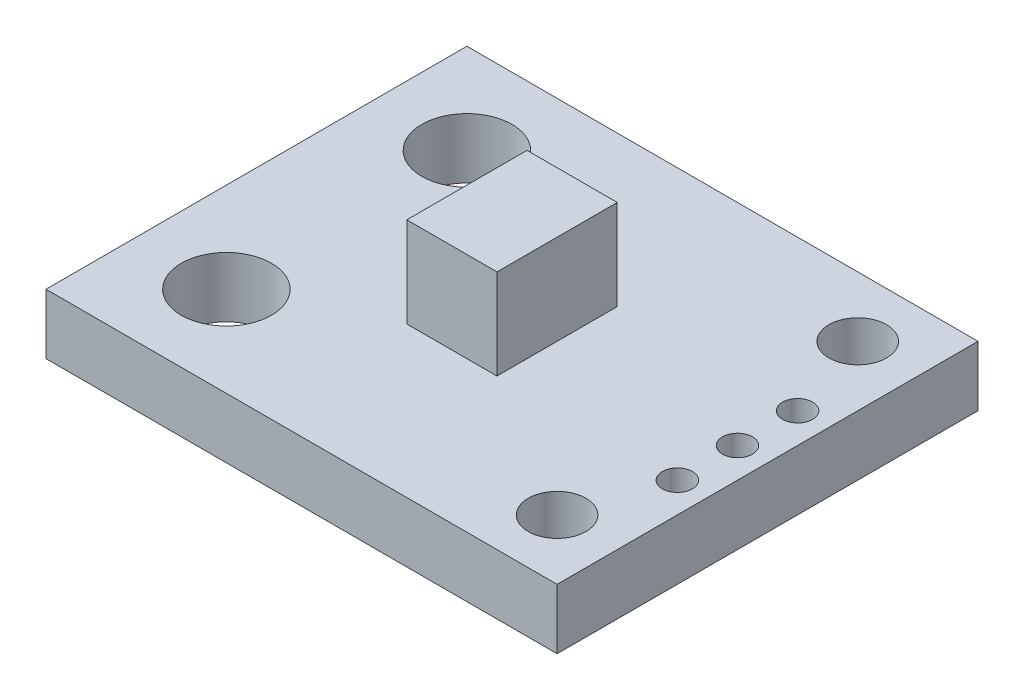
ISO-10303-21;
HEADER;
FILE_DESCRIPTION(('STEP AP214'),'2;1');
FILE_NAME('part.step','',(''),(''),'','','');
FILE_SCHEMA(('AUTOMOTIVE_DESIGN { 1 0 10303 214 1 1 1 1 }'));
ENDSEC;
DATA;
#1=APPLICATION_CONTEXT('core data for automotive mechanical design processes');
#2=APPLICATION_PROTOCOL_DEFINITION('international standard','automotive_design',2000,#1);
#3=PRODUCT_CONTEXT('',#1,'mechanical');
#4=PRODUCT('Part','Part','',(#3));
#5=PRODUCT_RELATED_PRODUCT_CATEGORY('part','',(#4));
#6=PRODUCT_DEFINITION_FORMATION('','',#4);
#7=PRODUCT_DEFINITION_CONTEXT('part definition',#1,'design');
#8=PRODUCT_DEFINITION('design','',#6,#7);
#9=PRODUCT_DEFINITION_SHAPE('','',#8);
#10=(LENGTH_UNIT() NAMED_UNIT(*) SI_UNIT(.MILLI.,.METRE.));
#11=(NAMED_UNIT(*) PLANE_ANGLE_UNIT() SI_UNIT($,.RADIAN.));
#12=(NAMED_UNIT(*) SI_UNIT($,.STERADIAN.) SOLID_ANGLE_UNIT());
#13=UNCERTAINTY_MEASURE_WITH_UNIT(LENGTH_MEASURE(1.E-05),#10,'distance_accuracy_value','');
#14=(GEOMETRIC_REPRESENTATION_CONTEXT(3) GLOBAL_UNCERTAINTY_ASSIGNED_CONTEXT((#13)) GLOBAL_UNIT_ASSIGNED_CONTEXT((#10,
#11,#12)) REPRESENTATION_CONTEXT('',''));
#15=CARTESIAN_POINT('',(0.,0.,0.));
#16=DIRECTION('',(0.,0.,1.));
#17=DIRECTION('',(1.,0.,0.));
#18=AXIS2_PLACEMENT_3D('',#15,#16,#17);
#19=CARTESIAN_POINT('',(0.,2.53999999999999,0.));
#20=DIRECTION('',(0.,1.,0.));
#21=DIRECTION('',(0.,0.,1.));
#22=AXIS2_PLACEMENT_3D('',#19,#20,#21);
#23=PLANE('',#22);
#24=CARTESIAN_POINT('',(8.255,2.53999999999999,-6.34999999999991));
#25=DIRECTION('',(0.,1.,0.));
#26=DIRECTION('',(0.,0.,1.));
#27=AXIS2_PLACEMENT_3D('',#24,#25,#26);
#28=CIRCLE('',#27,1.2192);
#29=CARTESIAN_POINT('',(8.255,2.53999999999999,-5.13079999999991));
#30=VERTEX_POINT('',#29);
#31=EDGE_CURVE('E264',#30,#30,#28,.T.);
#32=ORIENTED_EDGE('',*,*,#31,.F.);
#33=EDGE_LOOP('',(#32));
#34=FACE_BOUND('',#33,.T.);
#35=CARTESIAN_POINT('',(8.255,2.53999999999999,6.35000000000002));
#36=DIRECTION('',(0.,1.,0.));
#37=DIRECTION('',(0.,0.,1.));
#38=AXIS2_PLACEMENT_3D('',#35,#36,#37);
#39=CIRCLE('',#38,1.2192);
#40=CARTESIAN_POINT('',(8.255,2.53999999999999,7.56920000000002));
#41=VERTEX_POINT('',#40);
#42=EDGE_CURVE('E267',#41,#41,#39,.T.);
#43=ORIENTED_EDGE('',*,*,#42,.F.);
#44=EDGE_LOOP('',(#43));
#45=FACE_BOUND('',#44,.T.);
#46=DIRECTION('',(0.,0.,-1.));
#47=VECTOR('',#46,1.);
#48=CARTESIAN_POINT('',(10.795,2.53999999999999,-8.8899999999999));
#49=LINE('',#48,#47);
#50=CARTESIAN_POINT('',(10.795,2.53999999999999,8.89000000000001));
#51=VERTEX_POINT('',#50);
#52=CARTESIAN_POINT('',(10.795,2.53999999999999,-8.8899999999999));
#53=VERTEX_POINT('',#52);
#54=EDGE_CURVE('E171',#51,#53,#49,.T.);
#55=ORIENTED_EDGE('',*,*,#54,.T.);
#56=DIRECTION('',(-1.,0.,0.));
#57=VECTOR('',#56,1.);
#58=CARTESIAN_POINT('',(-10.795,2.53999999999999,-8.8899999999999));
#59=LINE('',#58,#57);
#60=CARTESIAN_POINT('',(-10.795,2.53999999999999,-8.8899999999999));
#61=VERTEX_POINT('',#60);
#62=EDGE_CURVE('E89',#53,#61,#59,.T.);
#63=ORIENTED_EDGE('',*,*,#62,.T.);
#64=DIRECTION('',(0.,0.,1.));
#65=VECTOR('',#64,1.);
#66=CARTESIAN_POINT('',(-10.795,2.53999999999999,-8.8899999999999));
#67=LINE('',#66,#65);
#68=CARTESIAN_POINT('',(-10.795,2.53999999999999,8.89000000000012));
#69=VERTEX_POINT('',#68);
#70=EDGE_CURVE('E174',#61,#69,#67,.T.);
#71=ORIENTED_EDGE('',*,*,#70,.T.);
#72=DIRECTION('',(1.,0.,0.));
#73=VECTOR('',#72,1.);
#74=CARTESIAN_POINT('',(-10.795,2.53999999999999,8.89000000000012));
#75=LINE('',#74,#73);
#76=EDGE_CURVE('E61',#69,#51,#75,.T.);
#77=ORIENTED_EDGE('',*,*,#76,.T.);
#78=EDGE_LOOP('',(#55,#63,#71,#77));
#79=FACE_BOUND('',#78,.T.);
#80=CARTESIAN_POINT('',(-6.985,2.53999999999999,-5.07999999999997));
#81=DIRECTION('',(0.,1.,0.));
#82=DIRECTION('',(0.,0.,1.));
#83=AXIS2_PLACEMENT_3D('',#80,#81,#82);
#84=CIRCLE('',#83,1.905);
#85=CARTESIAN_POINT('',(-6.985,2.53999999999999,-3.17499999999997));
#86=VERTEX_POINT('',#85);
#87=EDGE_CURVE('E162',#86,#86,#84,.T.);
#88=ORIENTED_EDGE('',*,*,#87,.F.);
#89=EDGE_LOOP('',(#88));
#90=FACE_BOUND('',#89,.T.);
#91=CARTESIAN_POINT('',(-6.985,2.53999999999999,5.07999999999997));
#92=DIRECTION('',(0.,1.,0.));
#93=DIRECTION('',(0.,0.,1.));
#94=AXIS2_PLACEMENT_3D('',#91,#92,#93);
#95=CIRCLE('',#94,1.905);
#96=CARTESIAN_POINT('',(-6.985,2.53999999999999,6.98499999999997));
#97=VERTEX_POINT('',#96);
#98=EDGE_CURVE('E156',#97,#97,#95,.T.);
#99=ORIENTED_EDGE('',*,*,#98,.F.);
#100=EDGE_LOOP('',(#99));
#101=FACE_BOUND('',#100,.T.);
#102=CARTESIAN_POINT('',(9.52500000000001,2.53999999999999,-2.53999999999999));
#103=DIRECTION('',(0.,1.,0.));
#104=DIRECTION('',(0.,0.,1.));
#105=AXIS2_PLACEMENT_3D('',#102,#103,#104);
#106=CIRCLE('',#105,0.635000000000001);
#107=CARTESIAN_POINT('',(9.52500000000001,2.53999999999999,-1.90499999999999));
#108=VERTEX_POINT('',#107);
#109=EDGE_CURVE('E150',#108,#108,#106,.T.);
#110=ORIENTED_EDGE('',*,*,#109,.F.);
#111=EDGE_LOOP('',(#110));
#112=FACE_BOUND('',#111,.T.);
#113=CARTESIAN_POINT('',(9.525,2.53999999999999,0.));
#114=DIRECTION('',(0.,1.,0.));
#115=DIRECTION('',(0.,0.,1.));
#116=AXIS2_PLACEMENT_3D('',#113,#114,#115);
#117=CIRCLE('',#116,0.635000000000004);
#118=CARTESIAN_POINT('',(9.525,2.53999999999999,0.635000000000004));
#119=VERTEX_POINT('',#118);
#120=EDGE_CURVE('E145',#119,#119,#117,.T.);
#121=ORIENTED_EDGE('',*,*,#120,.F.);
#122=EDGE_LOOP('',(#121));
#123=FACE_BOUND('',#122,.T.);
#124=CARTESIAN_POINT('',(9.525,2.53999999999999,2.53999999999999));
#125=DIRECTION('',(0.,1.,0.));
#126=DIRECTION('',(0.,0.,1.));
#127=AXIS2_PLACEMENT_3D('',#124,#125,#126);
#128=CIRCLE('',#127,0.635000000000001);
#129=CARTESIAN_POINT('',(9.525,2.53999999999999,3.17499999999999));
#130=VERTEX_POINT('',#129);
#131=EDGE_CURVE('E136',#130,#130,#128,.T.);
#132=ORIENTED_EDGE('',*,*,#131,.F.);
#133=EDGE_LOOP('',(#132));
#134=FACE_BOUND('',#133,.T.);
#135=DIRECTION('',(-1.,0.,0.));
#136=VECTOR('',#135,1.);
#137=CARTESIAN_POINT('',(-1.90499999999999,2.53999999999999,-2.53999999999999));
#138=LINE('',#137,#136);
#139=CARTESIAN_POINT('',(1.90500000000001,2.53999999999999,-2.53999999999999));
#140=VERTEX_POINT('',#139);
#141=CARTESIAN_POINT('',(-1.90499999999999,2.53999999999999,-2.53999999999999));
#142=VERTEX_POINT('',#141);
#143=EDGE_CURVE('E279',#140,#142,#138,.T.);
#144=ORIENTED_EDGE('',*,*,#143,.F.);
#145=DIRECTION('',(0.,0.,-1.));
#146=VECTOR('',#145,1.);
#147=CARTESIAN_POINT('',(1.90500000000001,2.53999999999999,-2.53999999999999));
#148=LINE('',#147,#146);
#149=CARTESIAN_POINT('',(1.90499999999998,2.53999999999999,2.53999999999999));
#150=VERTEX_POINT('',#149);
#151=EDGE_CURVE('E134',#150,#140,#148,.T.);
#152=ORIENTED_EDGE('',*,*,#151,.F.);
#153=DIRECTION('',(1.,0.,0.));
#154=VECTOR('',#153,1.);
#155=CARTESIAN_POINT('',(-1.90500000000001,2.53999999999999,2.53999999999999));
#156=LINE('',#155,#154);
#157=CARTESIAN_POINT('',(-1.90500000000001,2.53999999999999,2.53999999999999));
#158=VERTEX_POINT('',#157);
#159=EDGE_CURVE('E130',#158,#150,#156,.T.);
#160=ORIENTED_EDGE('',*,*,#159,.F.);
#161=DIRECTION('',(0.,0.,1.));
#162=VECTOR('',#161,1.);
#163=CARTESIAN_POINT('',(-1.90499999999999,2.53999999999999,-2.53999999999999));
#164=LINE('',#163,#162);
#165=EDGE_CURVE('E281',#142,#158,#164,.T.);
#166=ORIENTED_EDGE('',*,*,#165,.F.);
#167=EDGE_LOOP('',(#144,#152,#160,#166));
#168=FACE_BOUND('',#167,.T.);
#169=ADVANCED_FACE('F36',(#34,#45,#79,#90,#101,#112,#123,#134,#168),#23,.T.);
#170=CARTESIAN_POINT('',(10.795,2.53999999999999,-8.8899999999999));
#171=DIRECTION('',(-1.,0.,0.));
#172=DIRECTION('',(0.,0.,1.));
#173=AXIS2_PLACEMENT_3D('',#170,#171,#172);
#174=PLANE('',#173);
#175=DIRECTION('',(0.,0.,-1.));
#176=VECTOR('',#175,1.);
#177=CARTESIAN_POINT('',(10.795,0.,-8.8899999999999));
#178=LINE('',#177,#176);
#179=CARTESIAN_POINT('',(10.795,0.,8.89000000000001));
#180=VERTEX_POINT('',#179);
#181=CARTESIAN_POINT('',(10.795,0.,-8.8899999999999));
#182=VERTEX_POINT('',#181);
#183=EDGE_CURVE('E168',#180,#182,#178,.T.);
#184=ORIENTED_EDGE('',*,*,#183,.T.);
#185=DIRECTION('',(0.,-1.,0.));
#186=VECTOR('',#185,1.);
#187=CARTESIAN_POINT('',(10.795,2.53999999999999,-8.8899999999999));
#188=LINE('',#187,#186);
#189=EDGE_CURVE('E11',#53,#182,#188,.T.);
#190=ORIENTED_EDGE('',*,*,#189,.F.);
#191=ORIENTED_EDGE('',*,*,#54,.F.);
#192=DIRECTION('',(0.,-1.,0.));
#193=VECTOR('',#192,1.);
#194=CARTESIAN_POINT('',(10.795,2.53999999999999,8.89000000000001));
#195=LINE('',#194,#193);
#196=EDGE_CURVE('E177',#51,#180,#195,.T.);
#197=ORIENTED_EDGE('',*,*,#196,.T.);
#198=EDGE_LOOP('',(#184,#190,#191,#197));
#199=FACE_BOUND('',#198,.T.);
#200=ADVANCED_FACE('F38',(#199),#174,.F.);
#201=CARTESIAN_POINT('',(-10.795,2.53999999999999,-8.8899999999999));
#202=DIRECTION('',(0.,0.,1.));
#203=DIRECTION('',(1.,0.,0.));
#204=AXIS2_PLACEMENT_3D('',#201,#202,#203);
#205=PLANE('',#204);
#206=DIRECTION('',(-1.,0.,0.));
#207=VECTOR('',#206,1.);
#208=CARTESIAN_POINT('',(-10.795,0.,-8.8899999999999));
#209=LINE('',#208,#207);
#210=CARTESIAN_POINT('',(-10.795,0.,-8.8899999999999));
#211=VERTEX_POINT('',#210);
#212=EDGE_CURVE('E180',#182,#211,#209,.T.);
#213=ORIENTED_EDGE('',*,*,#212,.T.);
#214=DIRECTION('',(0.,-1.,0.));
#215=VECTOR('',#214,1.);
#216=CARTESIAN_POINT('',(-10.795,2.53999999999999,-8.8899999999999));
#217=LINE('',#216,#215);
#218=EDGE_CURVE('E45',#61,#211,#217,.T.);
#219=ORIENTED_EDGE('',*,*,#218,.F.);
#220=ORIENTED_EDGE('',*,*,#62,.F.);
#221=ORIENTED_EDGE('',*,*,#189,.T.);
#222=EDGE_LOOP('',(#213,#219,#220,#221));
#223=FACE_BOUND('',#222,.T.);
#224=ADVANCED_FACE('F210',(#223),#205,.F.);
#225=CARTESIAN_POINT('',(-10.795,2.53999999999999,-8.8899999999999));
#226=DIRECTION('',(1.,0.,0.));
#227=DIRECTION('',(0.,0.,-1.));
#228=AXIS2_PLACEMENT_3D('',#225,#226,#227);
#229=PLANE('',#228);
#230=DIRECTION('',(0.,0.,1.));
#231=VECTOR('',#230,1.);
#232=CARTESIAN_POINT('',(-10.795,0.,-8.8899999999999));
#233=LINE('',#232,#231);
#234=CARTESIAN_POINT('',(-10.795,0.,8.89000000000012));
#235=VERTEX_POINT('',#234);
#236=EDGE_CURVE('E182',#211,#235,#233,.T.);
#237=ORIENTED_EDGE('',*,*,#236,.T.);
#238=DIRECTION('',(0.,-1.,0.));
#239=VECTOR('',#238,1.);
#240=CARTESIAN_POINT('',(-10.795,2.53999999999999,8.89000000000012));
#241=LINE('',#240,#239);
#242=EDGE_CURVE('E186',#69,#235,#241,.T.);
#243=ORIENTED_EDGE('',*,*,#242,.F.);
#244=ORIENTED_EDGE('',*,*,#70,.F.);
#245=ORIENTED_EDGE('',*,*,#218,.T.);
#246=EDGE_LOOP('',(#237,#243,#244,#245));
#247=FACE_BOUND('',#246,.T.);
#248=ADVANCED_FACE('F192',(#247),#229,.F.);
#249=CARTESIAN_POINT('',(-10.795,2.53999999999999,8.89000000000012));
#250=DIRECTION('',(0.,0.,-1.));
#251=DIRECTION('',(-1.,0.,0.));
#252=AXIS2_PLACEMENT_3D('',#249,#250,#251);
#253=PLANE('',#252);
#254=DIRECTION('',(1.,0.,0.));
#255=VECTOR('',#254,1.);
#256=CARTESIAN_POINT('',(-10.795,0.,8.89000000000012));
#257=LINE('',#256,#255);
#258=EDGE_CURVE('E82',#235,#180,#257,.T.);
#259=ORIENTED_EDGE('',*,*,#258,.T.);
#260=ORIENTED_EDGE('',*,*,#196,.F.);
#261=ORIENTED_EDGE('',*,*,#76,.F.);
#262=ORIENTED_EDGE('',*,*,#242,.T.);
#263=EDGE_LOOP('',(#259,#260,#261,#262));
#264=FACE_BOUND('',#263,.T.);
#265=ADVANCED_FACE('F200',(#264),#253,.F.);
#266=CARTESIAN_POINT('',(0.,0.,0.));
#267=DIRECTION('',(0.,1.,0.));
#268=DIRECTION('',(0.,0.,1.));
#269=AXIS2_PLACEMENT_3D('',#266,#267,#268);
#270=PLANE('',#269);
#271=CARTESIAN_POINT('',(8.255,0.,-6.34999999999991));
#272=DIRECTION('',(0.,1.,0.));
#273=DIRECTION('',(0.,0.,1.));
#274=AXIS2_PLACEMENT_3D('',#271,#272,#273);
#275=CIRCLE('',#274,1.2192);
#276=CARTESIAN_POINT('',(8.255,0.,-5.13079999999991));
#277=VERTEX_POINT('',#276);
#278=EDGE_CURVE('E40',#277,#277,#275,.T.);
#279=ORIENTED_EDGE('',*,*,#278,.T.);
#280=EDGE_LOOP('',(#279));
#281=FACE_BOUND('',#280,.T.);
#282=CARTESIAN_POINT('',(8.255,0.,6.35000000000002));
#283=DIRECTION('',(0.,1.,0.));
#284=DIRECTION('',(0.,0.,1.));
#285=AXIS2_PLACEMENT_3D('',#282,#283,#284);
#286=CIRCLE('',#285,1.2192);
#287=CARTESIAN_POINT('',(8.255,0.,7.56920000000002));
#288=VERTEX_POINT('',#287);
#289=EDGE_CURVE('E269',#288,#288,#286,.T.);
#290=ORIENTED_EDGE('',*,*,#289,.T.);
#291=EDGE_LOOP('',(#290));
#292=FACE_BOUND('',#291,.T.);
#293=CARTESIAN_POINT('',(9.525,0.,2.53999999999999));
#294=DIRECTION('',(0.,1.,0.));
#295=DIRECTION('',(0.,0.,1.));
#296=AXIS2_PLACEMENT_3D('',#293,#294,#295);
#297=CIRCLE('',#296,0.635000000000001);
#298=CARTESIAN_POINT('',(9.525,0.,3.17499999999999));
#299=VERTEX_POINT('',#298);
#300=EDGE_CURVE('E139',#299,#299,#297,.T.);
#301=ORIENTED_EDGE('',*,*,#300,.T.);
#302=EDGE_LOOP('',(#301));
#303=FACE_BOUND('',#302,.T.);
#304=CARTESIAN_POINT('',(9.525,0.,0.));
#305=DIRECTION('',(0.,1.,0.));
#306=DIRECTION('',(0.,0.,1.));
#307=AXIS2_PLACEMENT_3D('',#304,#305,#306);
#308=CIRCLE('',#307,0.635000000000004);
#309=CARTESIAN_POINT('',(9.525,0.,0.635000000000004));
#310=VERTEX_POINT('',#309);
#311=EDGE_CURVE('E147',#310,#310,#308,.T.);
#312=ORIENTED_EDGE('',*,*,#311,.T.);
#313=EDGE_LOOP('',(#312));
#314=FACE_BOUND('',#313,.T.);
#315=CARTESIAN_POINT('',(9.52500000000001,0.,-2.53999999999999));
#316=DIRECTION('',(0.,1.,0.));
#317=DIRECTION('',(0.,0.,1.));
#318=AXIS2_PLACEMENT_3D('',#315,#316,#317);
#319=CIRCLE('',#318,0.635000000000001);
#320=CARTESIAN_POINT('',(9.52500000000001,0.,-1.90499999999999));
#321=VERTEX_POINT('',#320);
#322=EDGE_CURVE('E153',#321,#321,#319,.T.);
#323=ORIENTED_EDGE('',*,*,#322,.T.);
#324=EDGE_LOOP('',(#323));
#325=FACE_BOUND('',#324,.T.);
#326=CARTESIAN_POINT('',(-6.985,0.,5.07999999999997));
#327=DIRECTION('',(0.,1.,0.));
#328=DIRECTION('',(0.,0.,1.));
#329=AXIS2_PLACEMENT_3D('',#326,#327,#328);
#330=CIRCLE('',#329,1.905);
#331=CARTESIAN_POINT('',(-6.985,0.,6.98499999999997));
#332=VERTEX_POINT('',#331);
#333=EDGE_CURVE('E159',#332,#332,#330,.T.);
#334=ORIENTED_EDGE('',*,*,#333,.T.);
#335=EDGE_LOOP('',(#334));
#336=FACE_BOUND('',#335,.T.);
#337=CARTESIAN_POINT('',(-6.985,0.,-5.07999999999997));
#338=DIRECTION('',(0.,1.,0.));
#339=DIRECTION('',(0.,0.,1.));
#340=AXIS2_PLACEMENT_3D('',#337,#338,#339);
#341=CIRCLE('',#340,1.905);
#342=CARTESIAN_POINT('',(-6.985,0.,-3.17499999999997));
#343=VERTEX_POINT('',#342);
#344=EDGE_CURVE('E165',#343,#343,#341,.T.);
#345=ORIENTED_EDGE('',*,*,#344,.T.);
#346=EDGE_LOOP('',(#345));
#347=FACE_BOUND('',#346,.T.);
#348=ORIENTED_EDGE('',*,*,#183,.F.);
#349=ORIENTED_EDGE('',*,*,#258,.F.);
#350=ORIENTED_EDGE('',*,*,#236,.F.);
#351=ORIENTED_EDGE('',*,*,#212,.F.);
#352=EDGE_LOOP('',(#348,#349,#350,#351));
#353=FACE_BOUND('',#352,.T.);
#354=ADVANCED_FACE('F196',(#281,#292,#303,#314,#325,#336,#347,#353),#270,.F.);
#355=CARTESIAN_POINT('',(-6.985,0.,-5.07999999999997));
#356=DIRECTION('',(0.,1.,0.));
#357=DIRECTION('',(0.,0.,1.));
#358=AXIS2_PLACEMENT_3D('',#355,#356,#357);
#359=CYLINDRICAL_SURFACE('',#358,1.905);
#360=ORIENTED_EDGE('',*,*,#344,.F.);
#361=EDGE_LOOP('',(#360));
#362=FACE_BOUND('',#361,.T.);
#363=ORIENTED_EDGE('',*,*,#87,.T.);
#364=EDGE_LOOP('',(#363));
#365=FACE_BOUND('',#364,.T.);
#366=ADVANCED_FACE('F207',(#362,#365),#359,.F.);
#367=CARTESIAN_POINT('',(-6.985,0.,5.07999999999997));
#368=DIRECTION('',(0.,1.,0.));
#369=DIRECTION('',(0.,0.,1.));
#370=AXIS2_PLACEMENT_3D('',#367,#368,#369);
#371=CYLINDRICAL_SURFACE('',#370,1.905);
#372=ORIENTED_EDGE('',*,*,#333,.F.);
#373=EDGE_LOOP('',(#372));
#374=FACE_BOUND('',#373,.T.);
#375=ORIENTED_EDGE('',*,*,#98,.T.);
#376=EDGE_LOOP('',(#375));
#377=FACE_BOUND('',#376,.T.);
#378=ADVANCED_FACE('F223',(#374,#377),#371,.F.);
#379=CARTESIAN_POINT('',(9.52500000000001,0.,-2.53999999999999));
#380=DIRECTION('',(0.,1.,0.));
#381=DIRECTION('',(0.,0.,1.));
#382=AXIS2_PLACEMENT_3D('',#379,#380,#381);
#383=CYLINDRICAL_SURFACE('',#382,0.635000000000001);
#384=ORIENTED_EDGE('',*,*,#322,.F.);
#385=EDGE_LOOP('',(#384));
#386=FACE_BOUND('',#385,.T.);
#387=ORIENTED_EDGE('',*,*,#109,.T.);
#388=EDGE_LOOP('',(#387));
#389=FACE_BOUND('',#388,.T.);
#390=ADVANCED_FACE('F227',(#386,#389),#383,.F.);
#391=CARTESIAN_POINT('',(9.525,0.,0.));
#392=DIRECTION('',(0.,1.,0.));
#393=DIRECTION('',(0.,0.,1.));
#394=AXIS2_PLACEMENT_3D('',#391,#392,#393);
#395=CYLINDRICAL_SURFACE('',#394,0.635000000000004);
#396=ORIENTED_EDGE('',*,*,#311,.F.);
#397=EDGE_LOOP('',(#396));
#398=FACE_BOUND('',#397,.T.);
#399=ORIENTED_EDGE('',*,*,#120,.T.);
#400=EDGE_LOOP('',(#399));
#401=FACE_BOUND('',#400,.T.);
#402=ADVANCED_FACE('F231',(#398,#401),#395,.F.);
#403=CARTESIAN_POINT('',(9.525,0.,2.53999999999999));
#404=DIRECTION('',(0.,1.,0.));
#405=DIRECTION('',(0.,0.,1.));
#406=AXIS2_PLACEMENT_3D('',#403,#404,#405);
#407=CYLINDRICAL_SURFACE('',#406,0.635000000000001);
#408=ORIENTED_EDGE('',*,*,#300,.F.);
#409=EDGE_LOOP('',(#408));
#410=FACE_BOUND('',#409,.T.);
#411=ORIENTED_EDGE('',*,*,#131,.T.);
#412=EDGE_LOOP('',(#411));
#413=FACE_BOUND('',#412,.T.);
#414=ADVANCED_FACE('F235',(#410,#413),#407,.F.);
#415=CARTESIAN_POINT('',(1.90500000000001,6.35000000000008,-2.53999999999999));
#416=DIRECTION('',(-1.,0.,0.));
#417=DIRECTION('',(0.,0.,1.));
#418=AXIS2_PLACEMENT_3D('',#415,#416,#417);
#419=PLANE('',#418);
#420=ORIENTED_EDGE('',*,*,#151,.T.);
#421=DIRECTION('',(0.,-1.,0.));
#422=VECTOR('',#421,1.);
#423=CARTESIAN_POINT('',(1.90500000000001,6.35000000000008,-2.53999999999999));
#424=LINE('',#423,#422);
#425=CARTESIAN_POINT('',(1.90500000000001,6.35000000000008,-2.53999999999999));
#426=VERTEX_POINT('',#425);
#427=EDGE_CURVE('E115',#426,#140,#424,.T.);
#428=ORIENTED_EDGE('',*,*,#427,.F.);
#429=DIRECTION('',(0.,0.,-1.));
#430=VECTOR('',#429,1.);
#431=CARTESIAN_POINT('',(1.90500000000001,6.35000000000008,-2.53999999999999));
#432=LINE('',#431,#430);
#433=CARTESIAN_POINT('',(1.90499999999998,6.35000000000008,2.53999999999999));
#434=VERTEX_POINT('',#433);
#435=EDGE_CURVE('E122',#434,#426,#432,.T.);
#436=ORIENTED_EDGE('',*,*,#435,.F.);
#437=DIRECTION('',(0.,-1.,0.));
#438=VECTOR('',#437,1.);
#439=CARTESIAN_POINT('',(1.90499999999998,6.35000000000008,2.53999999999999));
#440=LINE('',#439,#438);
#441=EDGE_CURVE('E277',#434,#150,#440,.T.);
#442=ORIENTED_EDGE('',*,*,#441,.T.);
#443=EDGE_LOOP('',(#420,#428,#436,#442));
#444=FACE_BOUND('',#443,.T.);
#445=ADVANCED_FACE('F132',(#444),#419,.F.);
#446=CARTESIAN_POINT('',(-1.90499999999999,6.35000000000008,-2.53999999999999));
#447=DIRECTION('',(0.,0.,1.));
#448=DIRECTION('',(1.,0.,0.));
#449=AXIS2_PLACEMENT_3D('',#446,#447,#448);
#450=PLANE('',#449);
#451=ORIENTED_EDGE('',*,*,#143,.T.);
#452=DIRECTION('',(0.,-1.,0.));
#453=VECTOR('',#452,1.);
#454=CARTESIAN_POINT('',(-1.90499999999999,6.35000000000008,-2.53999999999999));
#455=LINE('',#454,#453);
#456=CARTESIAN_POINT('',(-1.90499999999999,6.35000000000008,-2.53999999999999));
#457=VERTEX_POINT('',#456);
#458=EDGE_CURVE('E118',#457,#142,#455,.T.);
#459=ORIENTED_EDGE('',*,*,#458,.F.);
#460=DIRECTION('',(-1.,0.,0.));
#461=VECTOR('',#460,1.);
#462=CARTESIAN_POINT('',(-1.90499999999999,6.35000000000008,-2.53999999999999));
#463=LINE('',#462,#461);
#464=EDGE_CURVE('E111',#426,#457,#463,.T.);
#465=ORIENTED_EDGE('',*,*,#464,.F.);
#466=ORIENTED_EDGE('',*,*,#427,.T.);
#467=EDGE_LOOP('',(#451,#459,#465,#466));
#468=FACE_BOUND('',#467,.T.);
#469=ADVANCED_FACE('F113',(#468),#450,.F.);
#470=CARTESIAN_POINT('',(-1.90499999999999,6.35000000000008,-2.53999999999999));
#471=DIRECTION('',(1.,0.,0.));
#472=DIRECTION('',(0.,0.,-1.));
#473=AXIS2_PLACEMENT_3D('',#470,#471,#472);
#474=PLANE('',#473);
#475=ORIENTED_EDGE('',*,*,#165,.T.);
#476=DIRECTION('',(0.,-1.,0.));
#477=VECTOR('',#476,1.);
#478=CARTESIAN_POINT('',(-1.90500000000001,6.35000000000008,2.53999999999999));
#479=LINE('',#478,#477);
#480=CARTESIAN_POINT('',(-1.90500000000001,6.35000000000008,2.53999999999999));
#481=VERTEX_POINT('',#480);
#482=EDGE_CURVE('E52',#481,#158,#479,.T.);
#483=ORIENTED_EDGE('',*,*,#482,.F.);
#484=DIRECTION('',(0.,0.,1.));
#485=VECTOR('',#484,1.);
#486=CARTESIAN_POINT('',(-1.90499999999999,6.35000000000008,-2.53999999999999));
#487=LINE('',#486,#485);
#488=EDGE_CURVE('E121',#457,#481,#487,.T.);
#489=ORIENTED_EDGE('',*,*,#488,.F.);
#490=ORIENTED_EDGE('',*,*,#458,.T.);
#491=EDGE_LOOP('',(#475,#483,#489,#490));
#492=FACE_BOUND('',#491,.T.);
#493=ADVANCED_FACE('F244',(#492),#474,.F.);
#494=CARTESIAN_POINT('',(-1.90500000000001,6.35000000000008,2.53999999999999));
#495=DIRECTION('',(0.,0.,-1.));
#496=DIRECTION('',(-1.,0.,0.));
#497=AXIS2_PLACEMENT_3D('',#494,#495,#496);
#498=PLANE('',#497);
#499=ORIENTED_EDGE('',*,*,#159,.T.);
#500=ORIENTED_EDGE('',*,*,#441,.F.);
#501=DIRECTION('',(1.,0.,0.));
#502=VECTOR('',#501,1.);
#503=CARTESIAN_POINT('',(-1.90500000000001,6.35000000000008,2.53999999999999));
#504=LINE('',#503,#502);
#505=EDGE_CURVE('E126',#481,#434,#504,.T.);
#506=ORIENTED_EDGE('',*,*,#505,.F.);
#507=ORIENTED_EDGE('',*,*,#482,.T.);
#508=EDGE_LOOP('',(#499,#500,#506,#507));
#509=FACE_BOUND('',#508,.T.);
#510=ADVANCED_FACE('F247',(#509),#498,.F.);
#511=CARTESIAN_POINT('',(0.,6.35000000000008,0.));
#512=DIRECTION('',(0.,1.,0.));
#513=DIRECTION('',(0.,0.,1.));
#514=AXIS2_PLACEMENT_3D('',#511,#512,#513);
#515=PLANE('',#514);
#516=ORIENTED_EDGE('',*,*,#435,.T.);
#517=ORIENTED_EDGE('',*,*,#464,.T.);
#518=ORIENTED_EDGE('',*,*,#488,.T.);
#519=ORIENTED_EDGE('',*,*,#505,.T.);
#520=EDGE_LOOP('',(#516,#517,#518,#519));
#521=FACE_BOUND('',#520,.T.);
#522=ADVANCED_FACE('F125',(#521),#515,.T.);
#523=CARTESIAN_POINT('',(8.255,2.53999999999999,6.35000000000002));
#524=DIRECTION('',(0.,1.,0.));
#525=DIRECTION('',(0.,0.,1.));
#526=AXIS2_PLACEMENT_3D('',#523,#524,#525);
#527=CYLINDRICAL_SURFACE('',#526,1.2192);
#528=ORIENTED_EDGE('',*,*,#42,.T.);
#529=EDGE_LOOP('',(#528));
#530=FACE_BOUND('',#529,.T.);
#531=ORIENTED_EDGE('',*,*,#289,.F.);
#532=EDGE_LOOP('',(#531));
#533=FACE_BOUND('',#532,.T.);
#534=ADVANCED_FACE('F253',(#530,#533),#527,.F.);
#535=CARTESIAN_POINT('',(8.255,2.53999999999999,-6.34999999999991));
#536=DIRECTION('',(0.,1.,0.));
#537=DIRECTION('',(0.,0.,1.));
#538=AXIS2_PLACEMENT_3D('',#535,#536,#537);
#539=CYLINDRICAL_SURFACE('',#538,1.2192);
#540=ORIENTED_EDGE('',*,*,#31,.T.);
#541=EDGE_LOOP('',(#540));
#542=FACE_BOUND('',#541,.T.);
#543=ORIENTED_EDGE('',*,*,#278,.F.);
#544=EDGE_LOOP('',(#543));
#545=FACE_BOUND('',#544,.T.);
#546=ADVANCED_FACE('F256',(#542,#545),#539,.F.);
#547=CLOSED_SHELL('',(#169,#200,#224,#248,#265,#354,#366,#378,#390,#402,#414,#445,#469,#493,
#510,#522,#534,#546));
#548=MANIFOLD_SOLID_BREP('B2',#547);
#549=ADVANCED_BREP_SHAPE_REPRESENTATION('',(#18,#548),#14);
#550=SHAPE_DEFINITION_REPRESENTATION(#9,#549);
ENDSEC;
END-ISO-10303-21;
